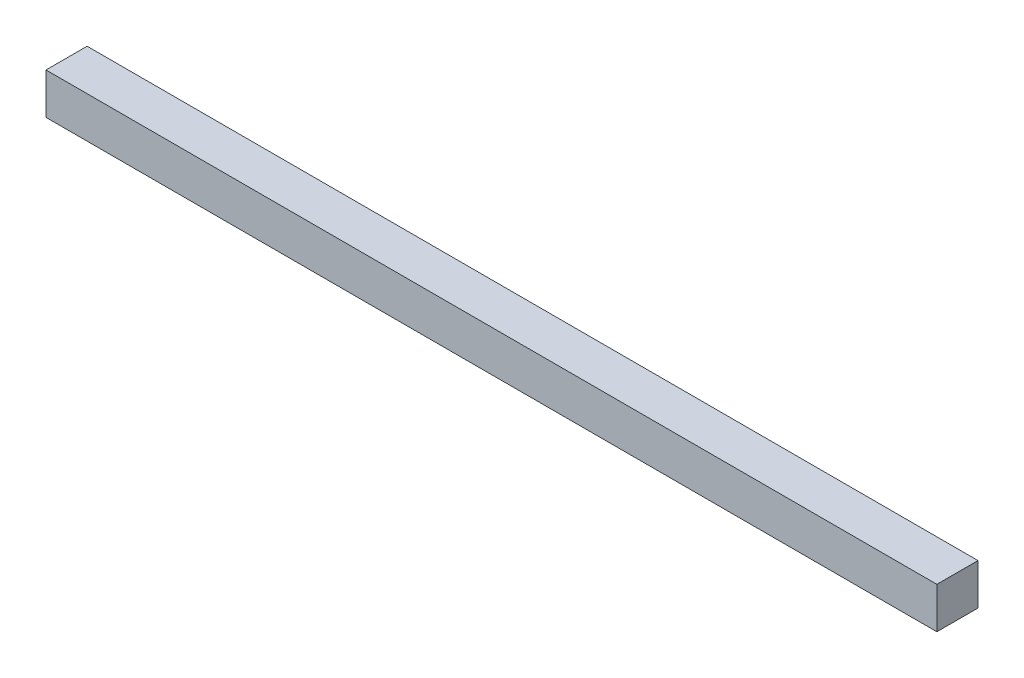
ISO-10303-21;
HEADER;
FILE_DESCRIPTION(('STEP AP214'),'2;1');
FILE_NAME('part.step','',(''),(''),'','','');
FILE_SCHEMA(('AUTOMOTIVE_DESIGN { 1 0 10303 214 1 1 1 1 }'));
ENDSEC;
DATA;
#1=APPLICATION_CONTEXT('core data for automotive mechanical design processes');
#2=APPLICATION_PROTOCOL_DEFINITION('international standard','automotive_design',2000,#1);
#3=PRODUCT_CONTEXT('',#1,'mechanical');
#4=PRODUCT('Part','Part','',(#3));
#5=PRODUCT_RELATED_PRODUCT_CATEGORY('part','',(#4));
#6=PRODUCT_DEFINITION_FORMATION('','',#4);
#7=PRODUCT_DEFINITION_CONTEXT('part definition',#1,'design');
#8=PRODUCT_DEFINITION('design','',#6,#7);
#9=PRODUCT_DEFINITION_SHAPE('','',#8);
#10=(LENGTH_UNIT() NAMED_UNIT(*) SI_UNIT(.MILLI.,.METRE.));
#11=(NAMED_UNIT(*) PLANE_ANGLE_UNIT() SI_UNIT($,.RADIAN.));
#12=(NAMED_UNIT(*) SI_UNIT($,.STERADIAN.) SOLID_ANGLE_UNIT());
#13=UNCERTAINTY_MEASURE_WITH_UNIT(LENGTH_MEASURE(1.E-05),#10,'distance_accuracy_value','');
#14=(GEOMETRIC_REPRESENTATION_CONTEXT(3) GLOBAL_UNCERTAINTY_ASSIGNED_CONTEXT((#13)) GLOBAL_UNIT_ASSIGNED_CONTEXT((#10,
#11,#12)) REPRESENTATION_CONTEXT('',''));
#15=CARTESIAN_POINT('',(0.,0.,0.));
#16=DIRECTION('',(0.,0.,1.));
#17=DIRECTION('',(1.,0.,0.));
#18=AXIS2_PLACEMENT_3D('',#15,#16,#17);
#19=CARTESIAN_POINT('',(0.,0.,12.));
#20=DIRECTION('',(1.,0.,0.));
#21=DIRECTION('',(0.,0.,-1.));
#22=AXIS2_PLACEMENT_3D('',#19,#20,#21);
#23=PLANE('',#22);
#24=DIRECTION('',(0.,-1.,0.));
#25=VECTOR('',#24,1.);
#26=CARTESIAN_POINT('',(0.,0.,0.));
#27=LINE('',#26,#25);
#28=CARTESIAN_POINT('',(0.,12.,0.));
#29=VERTEX_POINT('',#28);
#30=CARTESIAN_POINT('',(0.,0.,0.));
#31=VERTEX_POINT('',#30);
#32=EDGE_CURVE('E113',#29,#31,#27,.T.);
#33=ORIENTED_EDGE('',*,*,#32,.T.);
#34=DIRECTION('',(0.,0.,-1.));
#35=VECTOR('',#34,1.);
#36=CARTESIAN_POINT('',(0.,0.,12.));
#37=LINE('',#36,#35);
#38=CARTESIAN_POINT('',(0.,0.,12.));
#39=VERTEX_POINT('',#38);
#40=EDGE_CURVE('E11',#39,#31,#37,.T.);
#41=ORIENTED_EDGE('',*,*,#40,.F.);
#42=DIRECTION('',(0.,-1.,0.));
#43=VECTOR('',#42,1.);
#44=CARTESIAN_POINT('',(0.,0.,12.));
#45=LINE('',#44,#43);
#46=CARTESIAN_POINT('',(0.,12.,12.));
#47=VERTEX_POINT('',#46);
#48=EDGE_CURVE('E97',#47,#39,#45,.T.);
#49=ORIENTED_EDGE('',*,*,#48,.F.);
#50=DIRECTION('',(0.,0.,-1.));
#51=VECTOR('',#50,1.);
#52=CARTESIAN_POINT('',(0.,12.,12.));
#53=LINE('',#52,#51);
#54=EDGE_CURVE('E109',#47,#29,#53,.T.);
#55=ORIENTED_EDGE('',*,*,#54,.T.);
#56=EDGE_LOOP('',(#33,#41,#49,#55));
#57=FACE_BOUND('',#56,.T.);
#58=ADVANCED_FACE('F45',(#57),#23,.F.);
#59=CARTESIAN_POINT('',(0.,0.,12.));
#60=DIRECTION('',(0.,1.,0.));
#61=DIRECTION('',(0.,0.,1.));
#62=AXIS2_PLACEMENT_3D('',#59,#60,#61);
#63=PLANE('',#62);
#64=DIRECTION('',(1.,0.,0.));
#65=VECTOR('',#64,1.);
#66=CARTESIAN_POINT('',(0.,0.,0.));
#67=LINE('',#66,#65);
#68=CARTESIAN_POINT('',(260.,0.,0.));
#69=VERTEX_POINT('',#68);
#70=EDGE_CURVE('E102',#31,#69,#67,.T.);
#71=ORIENTED_EDGE('',*,*,#70,.T.);
#72=DIRECTION('',(0.,0.,-1.));
#73=VECTOR('',#72,1.);
#74=CARTESIAN_POINT('',(260.,0.,12.));
#75=LINE('',#74,#73);
#76=CARTESIAN_POINT('',(260.,0.,12.));
#77=VERTEX_POINT('',#76);
#78=EDGE_CURVE('E54',#77,#69,#75,.T.);
#79=ORIENTED_EDGE('',*,*,#78,.F.);
#80=DIRECTION('',(1.,0.,0.));
#81=VECTOR('',#80,1.);
#82=CARTESIAN_POINT('',(0.,0.,12.));
#83=LINE('',#82,#81);
#84=EDGE_CURVE('E92',#39,#77,#83,.T.);
#85=ORIENTED_EDGE('',*,*,#84,.F.);
#86=ORIENTED_EDGE('',*,*,#40,.T.);
#87=EDGE_LOOP('',(#71,#79,#85,#86));
#88=FACE_BOUND('',#87,.T.);
#89=ADVANCED_FACE('F101',(#88),#63,.F.);
#90=CARTESIAN_POINT('',(260.,0.,12.));
#91=DIRECTION('',(-1.,0.,0.));
#92=DIRECTION('',(0.,0.,1.));
#93=AXIS2_PLACEMENT_3D('',#90,#91,#92);
#94=PLANE('',#93);
#95=DIRECTION('',(0.,1.,0.));
#96=VECTOR('',#95,1.);
#97=CARTESIAN_POINT('',(260.,0.,0.));
#98=LINE('',#97,#96);
#99=CARTESIAN_POINT('',(260.,12.,0.));
#100=VERTEX_POINT('',#99);
#101=EDGE_CURVE('E79',#69,#100,#98,.T.);
#102=ORIENTED_EDGE('',*,*,#101,.T.);
#103=DIRECTION('',(0.,0.,-1.));
#104=VECTOR('',#103,1.);
#105=CARTESIAN_POINT('',(260.,12.,12.));
#106=LINE('',#105,#104);
#107=CARTESIAN_POINT('',(260.,12.,12.));
#108=VERTEX_POINT('',#107);
#109=EDGE_CURVE('E104',#108,#100,#106,.T.);
#110=ORIENTED_EDGE('',*,*,#109,.F.);
#111=DIRECTION('',(0.,1.,0.));
#112=VECTOR('',#111,1.);
#113=CARTESIAN_POINT('',(260.,0.,12.));
#114=LINE('',#113,#112);
#115=EDGE_CURVE('E95',#77,#108,#114,.T.);
#116=ORIENTED_EDGE('',*,*,#115,.F.);
#117=ORIENTED_EDGE('',*,*,#78,.T.);
#118=EDGE_LOOP('',(#102,#110,#116,#117));
#119=FACE_BOUND('',#118,.T.);
#120=ADVANCED_FACE('F105',(#119),#94,.F.);
#121=CARTESIAN_POINT('',(0.,12.,12.));
#122=DIRECTION('',(0.,-1.,0.));
#123=DIRECTION('',(0.,0.,-1.));
#124=AXIS2_PLACEMENT_3D('',#121,#122,#123);
#125=PLANE('',#124);
#126=DIRECTION('',(-1.,0.,0.));
#127=VECTOR('',#126,1.);
#128=CARTESIAN_POINT('',(0.,12.,0.));
#129=LINE('',#128,#127);
#130=EDGE_CURVE('E85',#100,#29,#129,.T.);
#131=ORIENTED_EDGE('',*,*,#130,.T.);
#132=ORIENTED_EDGE('',*,*,#54,.F.);
#133=DIRECTION('',(-1.,0.,0.));
#134=VECTOR('',#133,1.);
#135=CARTESIAN_POINT('',(0.,12.,12.));
#136=LINE('',#135,#134);
#137=EDGE_CURVE('E62',#108,#47,#136,.T.);
#138=ORIENTED_EDGE('',*,*,#137,.F.);
#139=ORIENTED_EDGE('',*,*,#109,.T.);
#140=EDGE_LOOP('',(#131,#132,#138,#139));
#141=FACE_BOUND('',#140,.T.);
#142=ADVANCED_FACE('F126',(#141),#125,.F.);
#143=CARTESIAN_POINT('',(0.,0.,12.));
#144=DIRECTION('',(0.,0.,-1.));
#145=DIRECTION('',(-1.,0.,0.));
#146=AXIS2_PLACEMENT_3D('',#143,#144,#145);
#147=PLANE('',#146);
#148=ORIENTED_EDGE('',*,*,#48,.T.);
#149=ORIENTED_EDGE('',*,*,#84,.T.);
#150=ORIENTED_EDGE('',*,*,#115,.T.);
#151=ORIENTED_EDGE('',*,*,#137,.T.);
#152=EDGE_LOOP('',(#148,#149,#150,#151));
#153=FACE_BOUND('',#152,.T.);
#154=ADVANCED_FACE('F93',(#153),#147,.F.);
#155=CARTESIAN_POINT('',(0.,0.,0.));
#156=DIRECTION('',(0.,0.,-1.));
#157=DIRECTION('',(-1.,0.,0.));
#158=AXIS2_PLACEMENT_3D('',#155,#156,#157);
#159=PLANE('',#158);
#160=ORIENTED_EDGE('',*,*,#32,.F.);
#161=ORIENTED_EDGE('',*,*,#130,.F.);
#162=ORIENTED_EDGE('',*,*,#101,.F.);
#163=ORIENTED_EDGE('',*,*,#70,.F.);
#164=EDGE_LOOP('',(#160,#161,#162,#163));
#165=FACE_BOUND('',#164,.T.);
#166=ADVANCED_FACE('F129',(#165),#159,.T.);
#167=CLOSED_SHELL('',(#58,#89,#120,#142,#154,#166));
#168=MANIFOLD_SOLID_BREP('B2',#167);
#169=ADVANCED_BREP_SHAPE_REPRESENTATION('',(#18,#168),#14);
#170=SHAPE_DEFINITION_REPRESENTATION(#9,#169);
ENDSEC;
END-ISO-10303-21;
